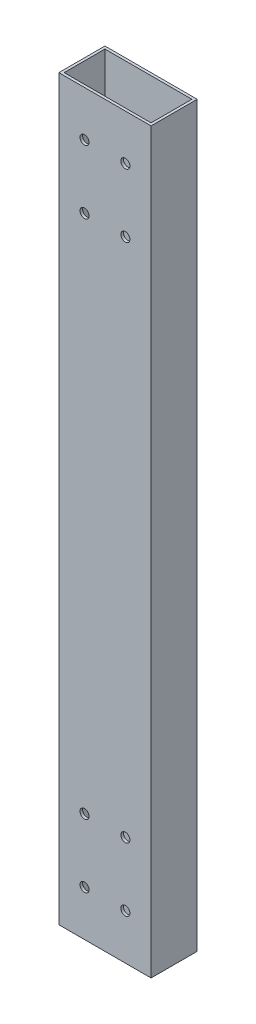
ISO-10303-21;
HEADER;
FILE_DESCRIPTION(('STEP AP214'),'2;1');
FILE_NAME('part.step','',(''),(''),'','','');
FILE_SCHEMA(('AUTOMOTIVE_DESIGN { 1 0 10303 214 1 1 1 1 }'));
ENDSEC;
DATA;
#1=APPLICATION_CONTEXT('core data for automotive mechanical design processes');
#2=APPLICATION_PROTOCOL_DEFINITION('international standard','automotive_design',2000,#1);
#3=PRODUCT_CONTEXT('',#1,'mechanical');
#4=PRODUCT('Part','Part','',(#3));
#5=PRODUCT_RELATED_PRODUCT_CATEGORY('part','',(#4));
#6=PRODUCT_DEFINITION_FORMATION('','',#4);
#7=PRODUCT_DEFINITION_CONTEXT('part definition',#1,'design');
#8=PRODUCT_DEFINITION('design','',#6,#7);
#9=PRODUCT_DEFINITION_SHAPE('','',#8);
#10=(LENGTH_UNIT() NAMED_UNIT(*) SI_UNIT(.MILLI.,.METRE.));
#11=(NAMED_UNIT(*) PLANE_ANGLE_UNIT() SI_UNIT($,.RADIAN.));
#12=(NAMED_UNIT(*) SI_UNIT($,.STERADIAN.) SOLID_ANGLE_UNIT());
#13=UNCERTAINTY_MEASURE_WITH_UNIT(LENGTH_MEASURE(1.E-05),#10,'distance_accuracy_value','');
#14=(GEOMETRIC_REPRESENTATION_CONTEXT(3) GLOBAL_UNCERTAINTY_ASSIGNED_CONTEXT((#13)) GLOBAL_UNIT_ASSIGNED_CONTEXT((#10,
#11,#12)) REPRESENTATION_CONTEXT('',''));
#15=CARTESIAN_POINT('',(0.,0.,0.));
#16=DIRECTION('',(0.,0.,1.));
#17=DIRECTION('',(1.,0.,0.));
#18=AXIS2_PLACEMENT_3D('',#15,#16,#17);
#19=CARTESIAN_POINT('',(0.,406.4,0.));
#20=DIRECTION('',(0.,-1.,0.));
#21=DIRECTION('',(0.,0.,-1.));
#22=AXIS2_PLACEMENT_3D('',#19,#20,#21);
#23=PLANE('',#22);
#24=DIRECTION('',(0.,0.,-1.));
#25=VECTOR('',#24,1.);
#26=CARTESIAN_POINT('',(25.4,406.4,12.7));
#27=LINE('',#26,#25);
#28=CARTESIAN_POINT('',(25.4,406.4,12.7));
#29=VERTEX_POINT('',#28);
#30=CARTESIAN_POINT('',(25.4,406.4,-12.7));
#31=VERTEX_POINT('',#30);
#32=EDGE_CURVE('E163',#29,#31,#27,.T.);
#33=ORIENTED_EDGE('',*,*,#32,.T.);
#34=DIRECTION('',(-1.,0.,0.));
#35=VECTOR('',#34,1.);
#36=CARTESIAN_POINT('',(-25.4,406.4,-12.7));
#37=LINE('',#36,#35);
#38=CARTESIAN_POINT('',(-25.4,406.4,-12.7));
#39=VERTEX_POINT('',#38);
#40=EDGE_CURVE('E167',#31,#39,#37,.T.);
#41=ORIENTED_EDGE('',*,*,#40,.T.);
#42=DIRECTION('',(0.,0.,1.));
#43=VECTOR('',#42,1.);
#44=CARTESIAN_POINT('',(-25.4,406.4,12.7));
#45=LINE('',#44,#43);
#46=CARTESIAN_POINT('',(-25.4,406.4,12.7));
#47=VERTEX_POINT('',#46);
#48=EDGE_CURVE('E171',#39,#47,#45,.T.);
#49=ORIENTED_EDGE('',*,*,#48,.T.);
#50=DIRECTION('',(1.,0.,0.));
#51=VECTOR('',#50,1.);
#52=CARTESIAN_POINT('',(-25.4,406.4,12.7));
#53=LINE('',#52,#51);
#54=EDGE_CURVE('E174',#47,#29,#53,.T.);
#55=ORIENTED_EDGE('',*,*,#54,.T.);
#56=EDGE_LOOP('',(#33,#41,#49,#55));
#57=FACE_BOUND('',#56,.T.);
#58=DIRECTION('',(0.,0.,1.));
#59=VECTOR('',#58,1.);
#60=CARTESIAN_POINT('',(-23.95,406.4,11.25));
#61=LINE('',#60,#59);
#62=CARTESIAN_POINT('',(-23.95,406.4,-11.25));
#63=VERTEX_POINT('',#62);
#64=CARTESIAN_POINT('',(-23.95,406.4,11.25));
#65=VERTEX_POINT('',#64);
#66=EDGE_CURVE('E113',#63,#65,#61,.T.);
#67=ORIENTED_EDGE('',*,*,#66,.F.);
#68=DIRECTION('',(-1.,0.,0.));
#69=VECTOR('',#68,1.);
#70=CARTESIAN_POINT('',(-23.95,406.4,-11.25));
#71=LINE('',#70,#69);
#72=CARTESIAN_POINT('',(23.95,406.4,-11.25));
#73=VERTEX_POINT('',#72);
#74=EDGE_CURVE('E139',#73,#63,#71,.T.);
#75=ORIENTED_EDGE('',*,*,#74,.F.);
#76=DIRECTION('',(0.,0.,-1.));
#77=VECTOR('',#76,1.);
#78=CARTESIAN_POINT('',(23.95,406.4,11.25));
#79=LINE('',#78,#77);
#80=CARTESIAN_POINT('',(23.95,406.4,11.25));
#81=VERTEX_POINT('',#80);
#82=EDGE_CURVE('E135',#81,#73,#79,.T.);
#83=ORIENTED_EDGE('',*,*,#82,.F.);
#84=DIRECTION('',(1.,0.,0.));
#85=VECTOR('',#84,1.);
#86=CARTESIAN_POINT('',(-23.95,406.4,11.25));
#87=LINE('',#86,#85);
#88=EDGE_CURVE('E122',#65,#81,#87,.T.);
#89=ORIENTED_EDGE('',*,*,#88,.F.);
#90=EDGE_LOOP('',(#67,#75,#83,#89));
#91=FACE_BOUND('',#90,.T.);
#92=ADVANCED_FACE('F45',(#57,#91),#23,.F.);
#93=CARTESIAN_POINT('',(0.,0.,0.));
#94=DIRECTION('',(0.,-1.,0.));
#95=DIRECTION('',(0.,0.,-1.));
#96=AXIS2_PLACEMENT_3D('',#93,#94,#95);
#97=PLANE('',#96);
#98=DIRECTION('',(0.,0.,-1.));
#99=VECTOR('',#98,1.);
#100=CARTESIAN_POINT('',(25.4,0.,12.7));
#101=LINE('',#100,#99);
#102=CARTESIAN_POINT('',(25.4,0.,12.7));
#103=VERTEX_POINT('',#102);
#104=CARTESIAN_POINT('',(25.4,0.,-12.7));
#105=VERTEX_POINT('',#104);
#106=EDGE_CURVE('E131',#103,#105,#101,.T.);
#107=ORIENTED_EDGE('',*,*,#106,.F.);
#108=DIRECTION('',(1.,0.,0.));
#109=VECTOR('',#108,1.);
#110=CARTESIAN_POINT('',(-25.4,0.,12.7));
#111=LINE('',#110,#109);
#112=CARTESIAN_POINT('',(-25.4,0.,12.7));
#113=VERTEX_POINT('',#112);
#114=EDGE_CURVE('E168',#113,#103,#111,.T.);
#115=ORIENTED_EDGE('',*,*,#114,.F.);
#116=DIRECTION('',(0.,0.,1.));
#117=VECTOR('',#116,1.);
#118=CARTESIAN_POINT('',(-25.4,0.,12.7));
#119=LINE('',#118,#117);
#120=CARTESIAN_POINT('',(-25.4,0.,-12.7));
#121=VERTEX_POINT('',#120);
#122=EDGE_CURVE('E184',#121,#113,#119,.T.);
#123=ORIENTED_EDGE('',*,*,#122,.F.);
#124=DIRECTION('',(-1.,0.,0.));
#125=VECTOR('',#124,1.);
#126=CARTESIAN_POINT('',(-25.4,0.,-12.7));
#127=LINE('',#126,#125);
#128=EDGE_CURVE('E181',#105,#121,#127,.T.);
#129=ORIENTED_EDGE('',*,*,#128,.F.);
#130=EDGE_LOOP('',(#107,#115,#123,#129));
#131=FACE_BOUND('',#130,.T.);
#132=DIRECTION('',(-1.,0.,0.));
#133=VECTOR('',#132,1.);
#134=CARTESIAN_POINT('',(-23.95,0.,-11.25));
#135=LINE('',#134,#133);
#136=CARTESIAN_POINT('',(23.95,0.,-11.25));
#137=VERTEX_POINT('',#136);
#138=CARTESIAN_POINT('',(-23.95,0.,-11.25));
#139=VERTEX_POINT('',#138);
#140=EDGE_CURVE('E123',#137,#139,#135,.T.);
#141=ORIENTED_EDGE('',*,*,#140,.T.);
#142=DIRECTION('',(0.,0.,1.));
#143=VECTOR('',#142,1.);
#144=CARTESIAN_POINT('',(-23.95,0.,11.25));
#145=LINE('',#144,#143);
#146=CARTESIAN_POINT('',(-23.95,0.,11.25));
#147=VERTEX_POINT('',#146);
#148=EDGE_CURVE('E71',#139,#147,#145,.T.);
#149=ORIENTED_EDGE('',*,*,#148,.T.);
#150=DIRECTION('',(1.,0.,0.));
#151=VECTOR('',#150,1.);
#152=CARTESIAN_POINT('',(-23.95,0.,11.25));
#153=LINE('',#152,#151);
#154=CARTESIAN_POINT('',(23.95,0.,11.25));
#155=VERTEX_POINT('',#154);
#156=EDGE_CURVE('E129',#147,#155,#153,.T.);
#157=ORIENTED_EDGE('',*,*,#156,.T.);
#158=DIRECTION('',(0.,0.,-1.));
#159=VECTOR('',#158,1.);
#160=CARTESIAN_POINT('',(23.95,0.,11.25));
#161=LINE('',#160,#159);
#162=EDGE_CURVE('E150',#155,#137,#161,.T.);
#163=ORIENTED_EDGE('',*,*,#162,.T.);
#164=EDGE_LOOP('',(#141,#149,#157,#163));
#165=FACE_BOUND('',#164,.T.);
#166=ADVANCED_FACE('F332',(#131,#165),#97,.T.);
#167=CARTESIAN_POINT('',(25.4,406.4,12.7));
#168=DIRECTION('',(-1.,0.,0.));
#169=DIRECTION('',(0.,0.,1.));
#170=AXIS2_PLACEMENT_3D('',#167,#168,#169);
#171=PLANE('',#170);
#172=ORIENTED_EDGE('',*,*,#106,.T.);
#173=DIRECTION('',(0.,-1.,0.));
#174=VECTOR('',#173,1.);
#175=CARTESIAN_POINT('',(25.4,406.4,-12.7));
#176=LINE('',#175,#174);
#177=EDGE_CURVE('E11',#31,#105,#176,.T.);
#178=ORIENTED_EDGE('',*,*,#177,.F.);
#179=ORIENTED_EDGE('',*,*,#32,.F.);
#180=DIRECTION('',(0.,-1.,0.));
#181=VECTOR('',#180,1.);
#182=CARTESIAN_POINT('',(25.4,406.4,12.7));
#183=LINE('',#182,#181);
#184=EDGE_CURVE('E177',#29,#103,#183,.T.);
#185=ORIENTED_EDGE('',*,*,#184,.T.);
#186=EDGE_LOOP('',(#172,#178,#179,#185));
#187=FACE_BOUND('',#186,.T.);
#188=ADVANCED_FACE('F47',(#187),#171,.F.);
#189=CARTESIAN_POINT('',(-25.4,406.4,-12.7));
#190=DIRECTION('',(0.,0.,1.));
#191=DIRECTION('',(1.,0.,0.));
#192=AXIS2_PLACEMENT_3D('',#189,#190,#191);
#193=PLANE('',#192);
#194=CARTESIAN_POINT('',(11.25,381.4,-12.7));
#195=DIRECTION('',(0.,0.,-1.));
#196=DIRECTION('',(1.,0.,0.));
#197=AXIS2_PLACEMENT_3D('',#194,#195,#196);
#198=CIRCLE('',#197,2.5);
#199=CARTESIAN_POINT('',(13.75,381.4,-12.7));
#200=VERTEX_POINT('',#199);
#201=EDGE_CURVE('E429',#200,#200,#198,.T.);
#202=ORIENTED_EDGE('',*,*,#201,.F.);
#203=EDGE_LOOP('',(#202));
#204=FACE_BOUND('',#203,.T.);
#205=CARTESIAN_POINT('',(-11.25,381.4,-12.7));
#206=DIRECTION('',(0.,0.,-1.));
#207=DIRECTION('',(1.,0.,0.));
#208=AXIS2_PLACEMENT_3D('',#205,#206,#207);
#209=CIRCLE('',#208,2.5);
#210=CARTESIAN_POINT('',(-8.75,381.4,-12.7));
#211=VERTEX_POINT('',#210);
#212=EDGE_CURVE('E415',#211,#211,#209,.T.);
#213=ORIENTED_EDGE('',*,*,#212,.F.);
#214=EDGE_LOOP('',(#213));
#215=FACE_BOUND('',#214,.T.);
#216=CARTESIAN_POINT('',(-11.25,346.4,-12.7));
#217=DIRECTION('',(0.,0.,-1.));
#218=DIRECTION('',(1.,0.,0.));
#219=AXIS2_PLACEMENT_3D('',#216,#217,#218);
#220=CIRCLE('',#219,2.5);
#221=CARTESIAN_POINT('',(-8.75,346.4,-12.7));
#222=VERTEX_POINT('',#221);
#223=EDGE_CURVE('E414',#222,#222,#220,.T.);
#224=ORIENTED_EDGE('',*,*,#223,.F.);
#225=EDGE_LOOP('',(#224));
#226=FACE_BOUND('',#225,.T.);
#227=CARTESIAN_POINT('',(11.25,346.4,-12.7));
#228=DIRECTION('',(0.,0.,-1.));
#229=DIRECTION('',(1.,0.,0.));
#230=AXIS2_PLACEMENT_3D('',#227,#228,#229);
#231=CIRCLE('',#230,2.5);
#232=CARTESIAN_POINT('',(13.75,346.4,-12.7));
#233=VERTEX_POINT('',#232);
#234=EDGE_CURVE('E224',#233,#233,#231,.T.);
#235=ORIENTED_EDGE('',*,*,#234,.F.);
#236=EDGE_LOOP('',(#235));
#237=FACE_BOUND('',#236,.T.);
#238=CARTESIAN_POINT('',(11.25,25.,-12.7));
#239=DIRECTION('',(0.,0.,1.));
#240=DIRECTION('',(1.,0.,0.));
#241=AXIS2_PLACEMENT_3D('',#238,#239,#240);
#242=CIRCLE('',#241,2.5);
#243=CARTESIAN_POINT('',(13.75,25.,-12.7));
#244=VERTEX_POINT('',#243);
#245=EDGE_CURVE('E250',#244,#244,#242,.T.);
#246=ORIENTED_EDGE('',*,*,#245,.T.);
#247=EDGE_LOOP('',(#246));
#248=FACE_BOUND('',#247,.T.);
#249=CARTESIAN_POINT('',(-11.25,25.,-12.7));
#250=DIRECTION('',(0.,0.,1.));
#251=DIRECTION('',(1.,0.,0.));
#252=AXIS2_PLACEMENT_3D('',#249,#250,#251);
#253=CIRCLE('',#252,2.5);
#254=CARTESIAN_POINT('',(-8.75,25.,-12.7));
#255=VERTEX_POINT('',#254);
#256=EDGE_CURVE('E264',#255,#255,#253,.T.);
#257=ORIENTED_EDGE('',*,*,#256,.T.);
#258=EDGE_LOOP('',(#257));
#259=FACE_BOUND('',#258,.T.);
#260=CARTESIAN_POINT('',(-11.25,60.,-12.7));
#261=DIRECTION('',(0.,0.,1.));
#262=DIRECTION('',(1.,0.,0.));
#263=AXIS2_PLACEMENT_3D('',#260,#261,#262);
#264=CIRCLE('',#263,2.5);
#265=CARTESIAN_POINT('',(-8.75,60.,-12.7));
#266=VERTEX_POINT('',#265);
#267=EDGE_CURVE('E256',#266,#266,#264,.T.);
#268=ORIENTED_EDGE('',*,*,#267,.T.);
#269=EDGE_LOOP('',(#268));
#270=FACE_BOUND('',#269,.T.);
#271=CARTESIAN_POINT('',(11.25,60.,-12.7));
#272=DIRECTION('',(0.,0.,1.));
#273=DIRECTION('',(1.,0.,0.));
#274=AXIS2_PLACEMENT_3D('',#271,#272,#273);
#275=CIRCLE('',#274,2.5);
#276=CARTESIAN_POINT('',(13.75,60.,-12.7));
#277=VERTEX_POINT('',#276);
#278=EDGE_CURVE('E204',#277,#277,#275,.T.);
#279=ORIENTED_EDGE('',*,*,#278,.T.);
#280=EDGE_LOOP('',(#279));
#281=FACE_BOUND('',#280,.T.);
#282=ORIENTED_EDGE('',*,*,#128,.T.);
#283=DIRECTION('',(0.,-1.,0.));
#284=VECTOR('',#283,1.);
#285=CARTESIAN_POINT('',(-25.4,406.4,-12.7));
#286=LINE('',#285,#284);
#287=EDGE_CURVE('E55',#39,#121,#286,.T.);
#288=ORIENTED_EDGE('',*,*,#287,.F.);
#289=ORIENTED_EDGE('',*,*,#40,.F.);
#290=ORIENTED_EDGE('',*,*,#177,.T.);
#291=EDGE_LOOP('',(#282,#288,#289,#290));
#292=FACE_BOUND('',#291,.T.);
#293=ADVANCED_FACE('F336',(#204,#215,#226,#237,#248,#259,#270,#281,#292),#193,.F.);
#294=CARTESIAN_POINT('',(-25.4,406.4,12.7));
#295=DIRECTION('',(1.,0.,0.));
#296=DIRECTION('',(0.,0.,-1.));
#297=AXIS2_PLACEMENT_3D('',#294,#295,#296);
#298=PLANE('',#297);
#299=ORIENTED_EDGE('',*,*,#122,.T.);
#300=DIRECTION('',(0.,-1.,0.));
#301=VECTOR('',#300,1.);
#302=CARTESIAN_POINT('',(-25.4,406.4,12.7));
#303=LINE('',#302,#301);
#304=EDGE_CURVE('E192',#47,#113,#303,.T.);
#305=ORIENTED_EDGE('',*,*,#304,.F.);
#306=ORIENTED_EDGE('',*,*,#48,.F.);
#307=ORIENTED_EDGE('',*,*,#287,.T.);
#308=EDGE_LOOP('',(#299,#305,#306,#307));
#309=FACE_BOUND('',#308,.T.);
#310=ADVANCED_FACE('F319',(#309),#298,.F.);
#311=CARTESIAN_POINT('',(-25.4,406.4,12.7));
#312=DIRECTION('',(0.,0.,-1.));
#313=DIRECTION('',(-1.,0.,0.));
#314=AXIS2_PLACEMENT_3D('',#311,#312,#313);
#315=PLANE('',#314);
#316=CARTESIAN_POINT('',(11.25,381.4,12.7));
#317=DIRECTION('',(0.,0.,-1.));
#318=DIRECTION('',(1.,0.,0.));
#319=AXIS2_PLACEMENT_3D('',#316,#317,#318);
#320=CIRCLE('',#319,2.5);
#321=CARTESIAN_POINT('',(13.75,381.4,12.7));
#322=VERTEX_POINT('',#321);
#323=EDGE_CURVE('E433',#322,#322,#320,.T.);
#324=ORIENTED_EDGE('',*,*,#323,.T.);
#325=EDGE_LOOP('',(#324));
#326=FACE_BOUND('',#325,.T.);
#327=CARTESIAN_POINT('',(-11.25,381.4,12.7));
#328=DIRECTION('',(0.,0.,-1.));
#329=DIRECTION('',(1.,0.,0.));
#330=AXIS2_PLACEMENT_3D('',#327,#328,#329);
#331=CIRCLE('',#330,2.5);
#332=CARTESIAN_POINT('',(-8.75,381.4,12.7));
#333=VERTEX_POINT('',#332);
#334=EDGE_CURVE('E423',#333,#333,#331,.T.);
#335=ORIENTED_EDGE('',*,*,#334,.T.);
#336=EDGE_LOOP('',(#335));
#337=FACE_BOUND('',#336,.T.);
#338=CARTESIAN_POINT('',(-11.25,346.4,12.7));
#339=DIRECTION('',(0.,0.,-1.));
#340=DIRECTION('',(1.,0.,0.));
#341=AXIS2_PLACEMENT_3D('',#338,#339,#340);
#342=CIRCLE('',#341,2.5);
#343=CARTESIAN_POINT('',(-8.75,346.4,12.7));
#344=VERTEX_POINT('',#343);
#345=EDGE_CURVE('E411',#344,#344,#342,.T.);
#346=ORIENTED_EDGE('',*,*,#345,.T.);
#347=EDGE_LOOP('',(#346));
#348=FACE_BOUND('',#347,.T.);
#349=CARTESIAN_POINT('',(11.25,346.4,12.7));
#350=DIRECTION('',(0.,0.,-1.));
#351=DIRECTION('',(1.,0.,0.));
#352=AXIS2_PLACEMENT_3D('',#349,#350,#351);
#353=CIRCLE('',#352,2.5);
#354=CARTESIAN_POINT('',(13.75,346.4,12.7));
#355=VERTEX_POINT('',#354);
#356=EDGE_CURVE('E420',#355,#355,#353,.T.);
#357=ORIENTED_EDGE('',*,*,#356,.T.);
#358=EDGE_LOOP('',(#357));
#359=FACE_BOUND('',#358,.T.);
#360=CARTESIAN_POINT('',(11.25,25.,12.7));
#361=DIRECTION('',(0.,0.,1.));
#362=DIRECTION('',(1.,0.,0.));
#363=AXIS2_PLACEMENT_3D('',#360,#361,#362);
#364=CIRCLE('',#363,2.5);
#365=CARTESIAN_POINT('',(13.75,25.,12.7));
#366=VERTEX_POINT('',#365);
#367=EDGE_CURVE('E268',#366,#366,#364,.T.);
#368=ORIENTED_EDGE('',*,*,#367,.F.);
#369=EDGE_LOOP('',(#368));
#370=FACE_BOUND('',#369,.T.);
#371=CARTESIAN_POINT('',(-11.25,25.,12.7));
#372=DIRECTION('',(0.,0.,1.));
#373=DIRECTION('',(1.,0.,0.));
#374=AXIS2_PLACEMENT_3D('',#371,#372,#373);
#375=CIRCLE('',#374,2.5);
#376=CARTESIAN_POINT('',(-8.75,25.,12.7));
#377=VERTEX_POINT('',#376);
#378=EDGE_CURVE('E260',#377,#377,#375,.T.);
#379=ORIENTED_EDGE('',*,*,#378,.F.);
#380=EDGE_LOOP('',(#379));
#381=FACE_BOUND('',#380,.T.);
#382=CARTESIAN_POINT('',(-11.25,60.,12.7));
#383=DIRECTION('',(0.,0.,1.));
#384=DIRECTION('',(1.,0.,0.));
#385=AXIS2_PLACEMENT_3D('',#382,#383,#384);
#386=CIRCLE('',#385,2.5);
#387=CARTESIAN_POINT('',(-8.75,60.,12.7));
#388=VERTEX_POINT('',#387);
#389=EDGE_CURVE('E251',#388,#388,#386,.T.);
#390=ORIENTED_EDGE('',*,*,#389,.F.);
#391=EDGE_LOOP('',(#390));
#392=FACE_BOUND('',#391,.T.);
#393=CARTESIAN_POINT('',(11.25,60.,12.7));
#394=DIRECTION('',(0.,0.,1.));
#395=DIRECTION('',(1.,0.,0.));
#396=AXIS2_PLACEMENT_3D('',#393,#394,#395);
#397=CIRCLE('',#396,2.5);
#398=CARTESIAN_POINT('',(13.75,60.,12.7));
#399=VERTEX_POINT('',#398);
#400=EDGE_CURVE('E255',#399,#399,#397,.T.);
#401=ORIENTED_EDGE('',*,*,#400,.F.);
#402=EDGE_LOOP('',(#401));
#403=FACE_BOUND('',#402,.T.);
#404=ORIENTED_EDGE('',*,*,#114,.T.);
#405=ORIENTED_EDGE('',*,*,#184,.F.);
#406=ORIENTED_EDGE('',*,*,#54,.F.);
#407=ORIENTED_EDGE('',*,*,#304,.T.);
#408=EDGE_LOOP('',(#404,#405,#406,#407));
#409=FACE_BOUND('',#408,.T.);
#410=ADVANCED_FACE('F316',(#326,#337,#348,#359,#370,#381,#392,#403,#409),#315,.F.);
#411=CARTESIAN_POINT('',(-23.95,406.4,11.25));
#412=DIRECTION('',(1.,0.,0.));
#413=DIRECTION('',(0.,0.,-1.));
#414=AXIS2_PLACEMENT_3D('',#411,#412,#413);
#415=PLANE('',#414);
#416=ORIENTED_EDGE('',*,*,#148,.F.);
#417=DIRECTION('',(0.,-1.,0.));
#418=VECTOR('',#417,1.);
#419=CARTESIAN_POINT('',(-23.95,406.4,-11.25));
#420=LINE('',#419,#418);
#421=EDGE_CURVE('E117',#63,#139,#420,.T.);
#422=ORIENTED_EDGE('',*,*,#421,.F.);
#423=ORIENTED_EDGE('',*,*,#66,.T.);
#424=DIRECTION('',(0.,-1.,0.));
#425=VECTOR('',#424,1.);
#426=CARTESIAN_POINT('',(-23.95,406.4,11.25));
#427=LINE('',#426,#425);
#428=EDGE_CURVE('E116',#65,#147,#427,.T.);
#429=ORIENTED_EDGE('',*,*,#428,.T.);
#430=EDGE_LOOP('',(#416,#422,#423,#429));
#431=FACE_BOUND('',#430,.T.);
#432=ADVANCED_FACE('F115',(#431),#415,.T.);
#433=CARTESIAN_POINT('',(-23.95,406.4,11.25));
#434=DIRECTION('',(0.,0.,-1.));
#435=DIRECTION('',(-1.,0.,0.));
#436=AXIS2_PLACEMENT_3D('',#433,#434,#435);
#437=PLANE('',#436);
#438=CARTESIAN_POINT('',(11.25,381.4,11.25));
#439=DIRECTION('',(0.,0.,-1.));
#440=DIRECTION('',(-1.,0.,0.));
#441=AXIS2_PLACEMENT_3D('',#438,#439,#440);
#442=CIRCLE('',#441,2.5);
#443=CARTESIAN_POINT('',(8.75,381.4,11.25));
#444=VERTEX_POINT('',#443);
#445=EDGE_CURVE('E246',#444,#444,#442,.F.);
#446=ORIENTED_EDGE('',*,*,#445,.T.);
#447=EDGE_LOOP('',(#446));
#448=FACE_BOUND('',#447,.T.);
#449=CARTESIAN_POINT('',(-11.25,381.4,11.25));
#450=DIRECTION('',(0.,0.,-1.));
#451=DIRECTION('',(-1.,0.,0.));
#452=AXIS2_PLACEMENT_3D('',#449,#450,#451);
#453=CIRCLE('',#452,2.5);
#454=CARTESIAN_POINT('',(-13.75,381.4,11.25));
#455=VERTEX_POINT('',#454);
#456=EDGE_CURVE('E232',#455,#455,#453,.F.);
#457=ORIENTED_EDGE('',*,*,#456,.T.);
#458=EDGE_LOOP('',(#457));
#459=FACE_BOUND('',#458,.T.);
#460=CARTESIAN_POINT('',(-11.25,346.4,11.25));
#461=DIRECTION('',(0.,0.,-1.));
#462=DIRECTION('',(-1.,0.,0.));
#463=AXIS2_PLACEMENT_3D('',#460,#461,#462);
#464=CIRCLE('',#463,2.5);
#465=CARTESIAN_POINT('',(-13.75,346.4,11.25));
#466=VERTEX_POINT('',#465);
#467=EDGE_CURVE('E228',#466,#466,#464,.F.);
#468=ORIENTED_EDGE('',*,*,#467,.T.);
#469=EDGE_LOOP('',(#468));
#470=FACE_BOUND('',#469,.T.);
#471=CARTESIAN_POINT('',(11.25,346.4,11.25));
#472=DIRECTION('',(0.,0.,-1.));
#473=DIRECTION('',(-1.,0.,0.));
#474=AXIS2_PLACEMENT_3D('',#471,#472,#473);
#475=CIRCLE('',#474,2.5);
#476=CARTESIAN_POINT('',(8.75,346.4,11.25));
#477=VERTEX_POINT('',#476);
#478=EDGE_CURVE('E223',#477,#477,#475,.F.);
#479=ORIENTED_EDGE('',*,*,#478,.T.);
#480=EDGE_LOOP('',(#479));
#481=FACE_BOUND('',#480,.T.);
#482=CARTESIAN_POINT('',(11.25,25.,11.25));
#483=DIRECTION('',(0.,0.,-1.));
#484=DIRECTION('',(-1.,0.,0.));
#485=AXIS2_PLACEMENT_3D('',#482,#483,#484);
#486=CIRCLE('',#485,2.5);
#487=CARTESIAN_POINT('',(8.75,25.,11.25));
#488=VERTEX_POINT('',#487);
#489=EDGE_CURVE('E147',#488,#488,#486,.T.);
#490=ORIENTED_EDGE('',*,*,#489,.F.);
#491=EDGE_LOOP('',(#490));
#492=FACE_BOUND('',#491,.T.);
#493=CARTESIAN_POINT('',(-11.25,25.,11.25));
#494=DIRECTION('',(0.,0.,-1.));
#495=DIRECTION('',(-1.,0.,0.));
#496=AXIS2_PLACEMENT_3D('',#493,#494,#495);
#497=CIRCLE('',#496,2.5);
#498=CARTESIAN_POINT('',(-13.75,25.,11.25));
#499=VERTEX_POINT('',#498);
#500=EDGE_CURVE('E214',#499,#499,#497,.T.);
#501=ORIENTED_EDGE('',*,*,#500,.F.);
#502=EDGE_LOOP('',(#501));
#503=FACE_BOUND('',#502,.T.);
#504=CARTESIAN_POINT('',(-11.25,60.,11.25));
#505=DIRECTION('',(0.,0.,-1.));
#506=DIRECTION('',(-1.,0.,0.));
#507=AXIS2_PLACEMENT_3D('',#504,#505,#506);
#508=CIRCLE('',#507,2.5);
#509=CARTESIAN_POINT('',(-13.75,60.,11.25));
#510=VERTEX_POINT('',#509);
#511=EDGE_CURVE('E209',#510,#510,#508,.T.);
#512=ORIENTED_EDGE('',*,*,#511,.F.);
#513=EDGE_LOOP('',(#512));
#514=FACE_BOUND('',#513,.T.);
#515=CARTESIAN_POINT('',(11.25,60.,11.25));
#516=DIRECTION('',(0.,0.,-1.));
#517=DIRECTION('',(-1.,0.,0.));
#518=AXIS2_PLACEMENT_3D('',#515,#516,#517);
#519=CIRCLE('',#518,2.5);
#520=CARTESIAN_POINT('',(8.75,60.,11.25));
#521=VERTEX_POINT('',#520);
#522=EDGE_CURVE('E203',#521,#521,#519,.T.);
#523=ORIENTED_EDGE('',*,*,#522,.F.);
#524=EDGE_LOOP('',(#523));
#525=FACE_BOUND('',#524,.T.);
#526=ORIENTED_EDGE('',*,*,#156,.F.);
#527=ORIENTED_EDGE('',*,*,#428,.F.);
#528=ORIENTED_EDGE('',*,*,#88,.T.);
#529=DIRECTION('',(0.,-1.,0.));
#530=VECTOR('',#529,1.);
#531=CARTESIAN_POINT('',(23.95,406.4,11.25));
#532=LINE('',#531,#530);
#533=EDGE_CURVE('E132',#81,#155,#532,.T.);
#534=ORIENTED_EDGE('',*,*,#533,.T.);
#535=EDGE_LOOP('',(#526,#527,#528,#534));
#536=FACE_BOUND('',#535,.T.);
#537=ADVANCED_FACE('F126',(#448,#459,#470,#481,#492,#503,#514,#525,#536),#437,.T.);
#538=CARTESIAN_POINT('',(23.95,406.4,11.25));
#539=DIRECTION('',(-1.,0.,0.));
#540=DIRECTION('',(0.,0.,1.));
#541=AXIS2_PLACEMENT_3D('',#538,#539,#540);
#542=PLANE('',#541);
#543=ORIENTED_EDGE('',*,*,#162,.F.);
#544=ORIENTED_EDGE('',*,*,#533,.F.);
#545=ORIENTED_EDGE('',*,*,#82,.T.);
#546=DIRECTION('',(0.,-1.,0.));
#547=VECTOR('',#546,1.);
#548=CARTESIAN_POINT('',(23.95,406.4,-11.25));
#549=LINE('',#548,#547);
#550=EDGE_CURVE('E63',#73,#137,#549,.T.);
#551=ORIENTED_EDGE('',*,*,#550,.T.);
#552=EDGE_LOOP('',(#543,#544,#545,#551));
#553=FACE_BOUND('',#552,.T.);
#554=ADVANCED_FACE('F298',(#553),#542,.T.);
#555=CARTESIAN_POINT('',(-23.95,406.4,-11.25));
#556=DIRECTION('',(0.,0.,1.));
#557=DIRECTION('',(1.,0.,0.));
#558=AXIS2_PLACEMENT_3D('',#555,#556,#557);
#559=PLANE('',#558);
#560=CARTESIAN_POINT('',(11.25,381.4,-11.25));
#561=DIRECTION('',(0.,0.,1.));
#562=DIRECTION('',(1.,0.,0.));
#563=AXIS2_PLACEMENT_3D('',#560,#561,#562);
#564=CIRCLE('',#563,2.5);
#565=CARTESIAN_POINT('',(13.75,381.4,-11.25));
#566=VERTEX_POINT('',#565);
#567=EDGE_CURVE('E49',#566,#566,#564,.F.);
#568=ORIENTED_EDGE('',*,*,#567,.T.);
#569=EDGE_LOOP('',(#568));
#570=FACE_BOUND('',#569,.T.);
#571=CARTESIAN_POINT('',(-11.25,381.4,-11.25));
#572=DIRECTION('',(0.,0.,1.));
#573=DIRECTION('',(1.,0.,0.));
#574=AXIS2_PLACEMENT_3D('',#571,#572,#573);
#575=CIRCLE('',#574,2.5);
#576=CARTESIAN_POINT('',(-8.75,381.4,-11.25));
#577=VERTEX_POINT('',#576);
#578=EDGE_CURVE('E229',#577,#577,#575,.F.);
#579=ORIENTED_EDGE('',*,*,#578,.T.);
#580=EDGE_LOOP('',(#579));
#581=FACE_BOUND('',#580,.T.);
#582=CARTESIAN_POINT('',(-11.25,346.4,-11.25));
#583=DIRECTION('',(0.,0.,1.));
#584=DIRECTION('',(1.,0.,0.));
#585=AXIS2_PLACEMENT_3D('',#582,#583,#584);
#586=CIRCLE('',#585,2.5);
#587=CARTESIAN_POINT('',(-8.75,346.4,-11.25));
#588=VERTEX_POINT('',#587);
#589=EDGE_CURVE('E225',#588,#588,#586,.F.);
#590=ORIENTED_EDGE('',*,*,#589,.T.);
#591=EDGE_LOOP('',(#590));
#592=FACE_BOUND('',#591,.T.);
#593=CARTESIAN_POINT('',(11.25,346.4,-11.25));
#594=DIRECTION('',(0.,0.,1.));
#595=DIRECTION('',(1.,0.,0.));
#596=AXIS2_PLACEMENT_3D('',#593,#594,#595);
#597=CIRCLE('',#596,2.5);
#598=CARTESIAN_POINT('',(13.75,346.4,-11.25));
#599=VERTEX_POINT('',#598);
#600=EDGE_CURVE('E219',#599,#599,#597,.F.);
#601=ORIENTED_EDGE('',*,*,#600,.T.);
#602=EDGE_LOOP('',(#601));
#603=FACE_BOUND('',#602,.T.);
#604=CARTESIAN_POINT('',(11.25,25.,-11.25));
#605=DIRECTION('',(0.,0.,1.));
#606=DIRECTION('',(1.,0.,0.));
#607=AXIS2_PLACEMENT_3D('',#604,#605,#606);
#608=CIRCLE('',#607,2.5);
#609=CARTESIAN_POINT('',(13.75,25.,-11.25));
#610=VERTEX_POINT('',#609);
#611=EDGE_CURVE('E215',#610,#610,#608,.T.);
#612=ORIENTED_EDGE('',*,*,#611,.F.);
#613=EDGE_LOOP('',(#612));
#614=FACE_BOUND('',#613,.T.);
#615=CARTESIAN_POINT('',(-11.25,25.,-11.25));
#616=DIRECTION('',(0.,0.,1.));
#617=DIRECTION('',(1.,0.,0.));
#618=AXIS2_PLACEMENT_3D('',#615,#616,#617);
#619=CIRCLE('',#618,2.5);
#620=CARTESIAN_POINT('',(-8.75,25.,-11.25));
#621=VERTEX_POINT('',#620);
#622=EDGE_CURVE('E210',#621,#621,#619,.T.);
#623=ORIENTED_EDGE('',*,*,#622,.F.);
#624=EDGE_LOOP('',(#623));
#625=FACE_BOUND('',#624,.T.);
#626=CARTESIAN_POINT('',(-11.25,60.,-11.25));
#627=DIRECTION('',(0.,0.,1.));
#628=DIRECTION('',(1.,0.,0.));
#629=AXIS2_PLACEMENT_3D('',#626,#627,#628);
#630=CIRCLE('',#629,2.5);
#631=CARTESIAN_POINT('',(-8.75,60.,-11.25));
#632=VERTEX_POINT('',#631);
#633=EDGE_CURVE('E205',#632,#632,#630,.T.);
#634=ORIENTED_EDGE('',*,*,#633,.F.);
#635=EDGE_LOOP('',(#634));
#636=FACE_BOUND('',#635,.T.);
#637=CARTESIAN_POINT('',(11.25,60.,-11.25));
#638=DIRECTION('',(0.,0.,1.));
#639=DIRECTION('',(1.,0.,0.));
#640=AXIS2_PLACEMENT_3D('',#637,#638,#639);
#641=CIRCLE('',#640,2.5);
#642=CARTESIAN_POINT('',(13.75,60.,-11.25));
#643=VERTEX_POINT('',#642);
#644=EDGE_CURVE('E199',#643,#643,#641,.T.);
#645=ORIENTED_EDGE('',*,*,#644,.F.);
#646=EDGE_LOOP('',(#645));
#647=FACE_BOUND('',#646,.T.);
#648=ORIENTED_EDGE('',*,*,#140,.F.);
#649=ORIENTED_EDGE('',*,*,#550,.F.);
#650=ORIENTED_EDGE('',*,*,#74,.T.);
#651=ORIENTED_EDGE('',*,*,#421,.T.);
#652=EDGE_LOOP('',(#648,#649,#650,#651));
#653=FACE_BOUND('',#652,.T.);
#654=ADVANCED_FACE('F358',(#570,#581,#592,#603,#614,#625,#636,#647,#653),#559,.T.);
#655=CARTESIAN_POINT('',(11.25,60.,-12.7));
#656=DIRECTION('',(0.,0.,1.));
#657=DIRECTION('',(1.,0.,0.));
#658=AXIS2_PLACEMENT_3D('',#655,#656,#657);
#659=CYLINDRICAL_SURFACE('',#658,2.5);
#660=ORIENTED_EDGE('',*,*,#644,.T.);
#661=EDGE_LOOP('',(#660));
#662=FACE_BOUND('',#661,.T.);
#663=ORIENTED_EDGE('',*,*,#278,.F.);
#664=EDGE_LOOP('',(#663));
#665=FACE_BOUND('',#664,.T.);
#666=ADVANCED_FACE('F313',(#662,#665),#659,.F.);
#667=CARTESIAN_POINT('',(-11.25,60.,-12.7));
#668=DIRECTION('',(0.,0.,1.));
#669=DIRECTION('',(1.,0.,0.));
#670=AXIS2_PLACEMENT_3D('',#667,#668,#669);
#671=CYLINDRICAL_SURFACE('',#670,2.5);
#672=ORIENTED_EDGE('',*,*,#633,.T.);
#673=EDGE_LOOP('',(#672));
#674=FACE_BOUND('',#673,.T.);
#675=ORIENTED_EDGE('',*,*,#267,.F.);
#676=EDGE_LOOP('',(#675));
#677=FACE_BOUND('',#676,.T.);
#678=ADVANCED_FACE('F364',(#674,#677),#671,.F.);
#679=CARTESIAN_POINT('',(-11.25,25.,-12.7));
#680=DIRECTION('',(0.,0.,1.));
#681=DIRECTION('',(1.,0.,0.));
#682=AXIS2_PLACEMENT_3D('',#679,#680,#681);
#683=CYLINDRICAL_SURFACE('',#682,2.5);
#684=ORIENTED_EDGE('',*,*,#622,.T.);
#685=EDGE_LOOP('',(#684));
#686=FACE_BOUND('',#685,.T.);
#687=ORIENTED_EDGE('',*,*,#256,.F.);
#688=EDGE_LOOP('',(#687));
#689=FACE_BOUND('',#688,.T.);
#690=ADVANCED_FACE('F368',(#686,#689),#683,.F.);
#691=CARTESIAN_POINT('',(11.25,25.,-12.7));
#692=DIRECTION('',(0.,0.,1.));
#693=DIRECTION('',(1.,0.,0.));
#694=AXIS2_PLACEMENT_3D('',#691,#692,#693);
#695=CYLINDRICAL_SURFACE('',#694,2.5);
#696=ORIENTED_EDGE('',*,*,#611,.T.);
#697=EDGE_LOOP('',(#696));
#698=FACE_BOUND('',#697,.T.);
#699=ORIENTED_EDGE('',*,*,#245,.F.);
#700=EDGE_LOOP('',(#699));
#701=FACE_BOUND('',#700,.T.);
#702=ADVANCED_FACE('F311',(#698,#701),#695,.F.);
#703=ORIENTED_EDGE('',*,*,#522,.T.);
#704=EDGE_LOOP('',(#703));
#705=FACE_BOUND('',#704,.T.);
#706=ORIENTED_EDGE('',*,*,#400,.T.);
#707=EDGE_LOOP('',(#706));
#708=FACE_BOUND('',#707,.T.);
#709=ADVANCED_FACE('F307',(#705,#708),#659,.F.);
#710=ORIENTED_EDGE('',*,*,#511,.T.);
#711=EDGE_LOOP('',(#710));
#712=FACE_BOUND('',#711,.T.);
#713=ORIENTED_EDGE('',*,*,#389,.T.);
#714=EDGE_LOOP('',(#713));
#715=FACE_BOUND('',#714,.T.);
#716=ADVANCED_FACE('F310',(#712,#715),#671,.F.);
#717=ORIENTED_EDGE('',*,*,#500,.T.);
#718=EDGE_LOOP('',(#717));
#719=FACE_BOUND('',#718,.T.);
#720=ORIENTED_EDGE('',*,*,#378,.T.);
#721=EDGE_LOOP('',(#720));
#722=FACE_BOUND('',#721,.T.);
#723=ADVANCED_FACE('F373',(#719,#722),#683,.F.);
#724=ORIENTED_EDGE('',*,*,#489,.T.);
#725=EDGE_LOOP('',(#724));
#726=FACE_BOUND('',#725,.T.);
#727=ORIENTED_EDGE('',*,*,#367,.T.);
#728=EDGE_LOOP('',(#727));
#729=FACE_BOUND('',#728,.T.);
#730=ADVANCED_FACE('F293',(#726,#729),#695,.F.);
#731=CARTESIAN_POINT('',(11.25,346.4,-12.7));
#732=DIRECTION('',(0.,0.,1.));
#733=DIRECTION('',(1.,0.,0.));
#734=AXIS2_PLACEMENT_3D('',#731,#732,#733);
#735=CYLINDRICAL_SURFACE('',#734,2.5);
#736=ORIENTED_EDGE('',*,*,#600,.F.);
#737=EDGE_LOOP('',(#736));
#738=FACE_BOUND('',#737,.T.);
#739=ORIENTED_EDGE('',*,*,#234,.T.);
#740=EDGE_LOOP('',(#739));
#741=FACE_BOUND('',#740,.T.);
#742=ADVANCED_FACE('F377',(#738,#741),#735,.F.);
#743=CARTESIAN_POINT('',(-11.25,346.4,-12.7));
#744=DIRECTION('',(0.,0.,1.));
#745=DIRECTION('',(1.,0.,0.));
#746=AXIS2_PLACEMENT_3D('',#743,#744,#745);
#747=CYLINDRICAL_SURFACE('',#746,2.5);
#748=ORIENTED_EDGE('',*,*,#589,.F.);
#749=EDGE_LOOP('',(#748));
#750=FACE_BOUND('',#749,.T.);
#751=ORIENTED_EDGE('',*,*,#223,.T.);
#752=EDGE_LOOP('',(#751));
#753=FACE_BOUND('',#752,.T.);
#754=ADVANCED_FACE('F380',(#750,#753),#747,.F.);
#755=CARTESIAN_POINT('',(-11.25,381.4,-12.7));
#756=DIRECTION('',(0.,0.,1.));
#757=DIRECTION('',(1.,0.,0.));
#758=AXIS2_PLACEMENT_3D('',#755,#756,#757);
#759=CYLINDRICAL_SURFACE('',#758,2.5);
#760=ORIENTED_EDGE('',*,*,#578,.F.);
#761=EDGE_LOOP('',(#760));
#762=FACE_BOUND('',#761,.T.);
#763=ORIENTED_EDGE('',*,*,#212,.T.);
#764=EDGE_LOOP('',(#763));
#765=FACE_BOUND('',#764,.T.);
#766=ADVANCED_FACE('F386',(#762,#765),#759,.F.);
#767=CARTESIAN_POINT('',(11.25,381.4,-12.7));
#768=DIRECTION('',(0.,0.,1.));
#769=DIRECTION('',(1.,0.,0.));
#770=AXIS2_PLACEMENT_3D('',#767,#768,#769);
#771=CYLINDRICAL_SURFACE('',#770,2.5);
#772=ORIENTED_EDGE('',*,*,#567,.F.);
#773=EDGE_LOOP('',(#772));
#774=FACE_BOUND('',#773,.T.);
#775=ORIENTED_EDGE('',*,*,#201,.T.);
#776=EDGE_LOOP('',(#775));
#777=FACE_BOUND('',#776,.T.);
#778=ADVANCED_FACE('F383',(#774,#777),#771,.F.);
#779=ORIENTED_EDGE('',*,*,#478,.F.);
#780=EDGE_LOOP('',(#779));
#781=FACE_BOUND('',#780,.T.);
#782=ORIENTED_EDGE('',*,*,#356,.F.);
#783=EDGE_LOOP('',(#782));
#784=FACE_BOUND('',#783,.T.);
#785=ADVANCED_FACE('F382',(#781,#784),#735,.F.);
#786=ORIENTED_EDGE('',*,*,#467,.F.);
#787=EDGE_LOOP('',(#786));
#788=FACE_BOUND('',#787,.T.);
#789=ORIENTED_EDGE('',*,*,#345,.F.);
#790=EDGE_LOOP('',(#789));
#791=FACE_BOUND('',#790,.T.);
#792=ADVANCED_FACE('F395',(#788,#791),#747,.F.);
#793=ORIENTED_EDGE('',*,*,#456,.F.);
#794=EDGE_LOOP('',(#793));
#795=FACE_BOUND('',#794,.T.);
#796=ORIENTED_EDGE('',*,*,#334,.F.);
#797=EDGE_LOOP('',(#796));
#798=FACE_BOUND('',#797,.T.);
#799=ADVANCED_FACE('F392',(#795,#798),#759,.F.);
#800=ORIENTED_EDGE('',*,*,#445,.F.);
#801=EDGE_LOOP('',(#800));
#802=FACE_BOUND('',#801,.T.);
#803=ORIENTED_EDGE('',*,*,#323,.F.);
#804=EDGE_LOOP('',(#803));
#805=FACE_BOUND('',#804,.T.);
#806=ADVANCED_FACE('F388',(#802,#805),#771,.F.);
#807=CLOSED_SHELL('',(#92,#166,#188,#293,#310,#410,#432,#537,#554,#654,#666,#678,#690,#702,#709,
#716,#723,#730,#742,#754,#766,#778,#785,#792,#799,#806));
#808=MANIFOLD_SOLID_BREP('B2',#807);
#809=ADVANCED_BREP_SHAPE_REPRESENTATION('',(#18,#808),#14);
#810=SHAPE_DEFINITION_REPRESENTATION(#9,#809);
ENDSEC;
END-ISO-10303-21;
